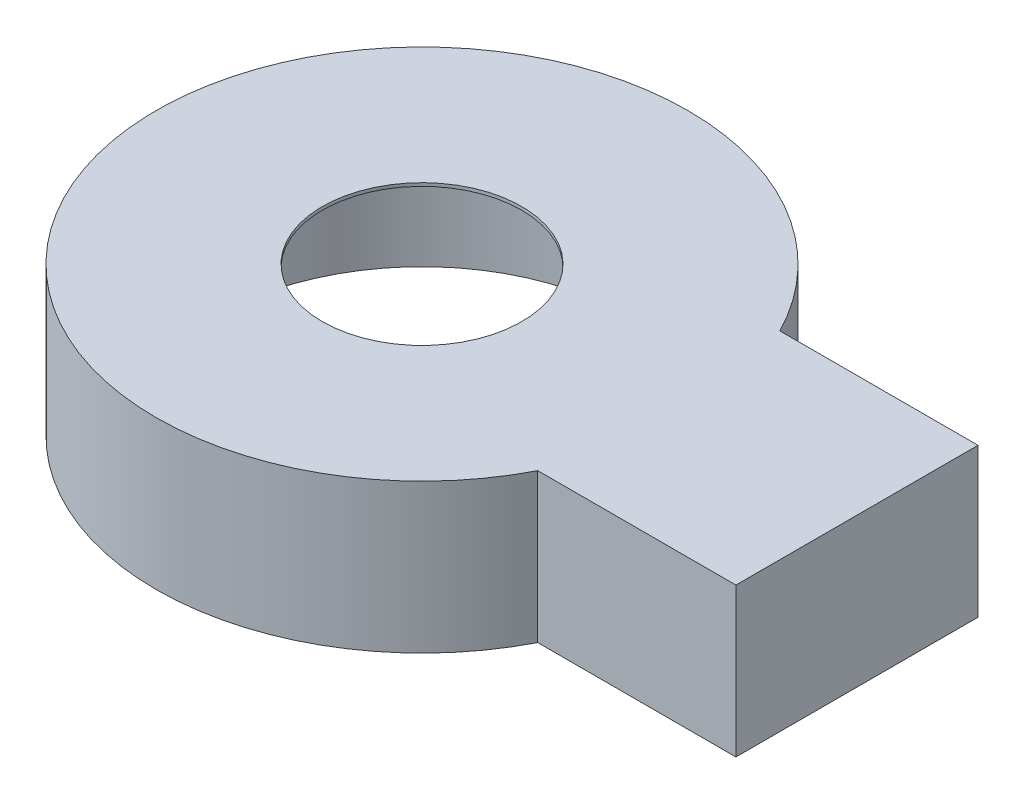
ISO-10303-21;
HEADER;
FILE_DESCRIPTION(('STEP AP214'),'2;1');
FILE_NAME('part.step','',(''),(''),'','','');
FILE_SCHEMA(('AUTOMOTIVE_DESIGN { 1 0 10303 214 1 1 1 1 }'));
ENDSEC;
DATA;
#1=APPLICATION_CONTEXT('core data for automotive mechanical design processes');
#2=APPLICATION_PROTOCOL_DEFINITION('international standard','automotive_design',2000,#1);
#3=PRODUCT_CONTEXT('',#1,'mechanical');
#4=PRODUCT('Part','Part','',(#3));
#5=PRODUCT_RELATED_PRODUCT_CATEGORY('part','',(#4));
#6=PRODUCT_DEFINITION_FORMATION('','',#4);
#7=PRODUCT_DEFINITION_CONTEXT('part definition',#1,'design');
#8=PRODUCT_DEFINITION('design','',#6,#7);
#9=PRODUCT_DEFINITION_SHAPE('','',#8);
#10=(LENGTH_UNIT() NAMED_UNIT(*) SI_UNIT(.MILLI.,.METRE.));
#11=(NAMED_UNIT(*) PLANE_ANGLE_UNIT() SI_UNIT($,.RADIAN.));
#12=(NAMED_UNIT(*) SI_UNIT($,.STERADIAN.) SOLID_ANGLE_UNIT());
#13=UNCERTAINTY_MEASURE_WITH_UNIT(LENGTH_MEASURE(1.E-05),#10,'distance_accuracy_value','');
#14=(GEOMETRIC_REPRESENTATION_CONTEXT(3) GLOBAL_UNCERTAINTY_ASSIGNED_CONTEXT((#13)) GLOBAL_UNIT_ASSIGNED_CONTEXT((#10,
#11,#12)) REPRESENTATION_CONTEXT('',''));
#15=CARTESIAN_POINT('',(0.,0.,0.));
#16=DIRECTION('',(0.,0.,1.));
#17=DIRECTION('',(1.,0.,0.));
#18=AXIS2_PLACEMENT_3D('',#15,#16,#17);
#19=CARTESIAN_POINT('',(0.,-3.556,0.));
#20=DIRECTION('',(0.,1.,0.));
#21=DIRECTION('',(0.,0.,1.));
#22=AXIS2_PLACEMENT_3D('',#19,#20,#21);
#23=PLANE('',#22);
#24=CARTESIAN_POINT('',(0.,-3.556,0.));
#25=DIRECTION('',(0.,1.,0.));
#26=DIRECTION('',(0.,0.,1.));
#27=AXIS2_PLACEMENT_3D('',#24,#25,#26);
#28=CIRCLE('',#27,6.35);
#29=CARTESIAN_POINT('',(5.65400955925136,-3.556,-2.8904456237567));
#30=VERTEX_POINT('',#29);
#31=CARTESIAN_POINT('',(5.65400955925136,-3.556,2.8904456237567));
#32=VERTEX_POINT('',#31);
#33=EDGE_CURVE('E176',#30,#32,#28,.T.);
#34=ORIENTED_EDGE('',*,*,#33,.F.);
#35=DIRECTION('',(-1.,0.,0.));
#36=VECTOR('',#35,1.);
#37=CARTESIAN_POINT('',(8.02011647499063,-3.556,-2.8904456237567));
#38=LINE('',#37,#36);
#39=CARTESIAN_POINT('',(10.3862233907299,-3.556,-2.8904456237567));
#40=VERTEX_POINT('',#39);
#41=EDGE_CURVE('E74',#40,#30,#38,.T.);
#42=ORIENTED_EDGE('',*,*,#41,.F.);
#43=DIRECTION('',(0.,0.,-1.));
#44=VECTOR('',#43,1.);
#45=CARTESIAN_POINT('',(10.3862233907299,-3.556,-2.8904456237567));
#46=LINE('',#45,#44);
#47=CARTESIAN_POINT('',(10.3862233907299,-3.556,2.8904456237567));
#48=VERTEX_POINT('',#47);
#49=EDGE_CURVE('E254',#48,#40,#46,.T.);
#50=ORIENTED_EDGE('',*,*,#49,.F.);
#51=DIRECTION('',(1.,0.,0.));
#52=VECTOR('',#51,1.);
#53=CARTESIAN_POINT('',(5.65400955925136,-3.556,2.8904456237567));
#54=LINE('',#53,#52);
#55=EDGE_CURVE('E258',#32,#48,#54,.T.);
#56=ORIENTED_EDGE('',*,*,#55,.F.);
#57=EDGE_LOOP('',(#34,#42,#50,#56));
#58=FACE_BOUND('',#57,.T.);
#59=CARTESIAN_POINT('',(0.,-3.556,0.));
#60=DIRECTION('',(0.,-1.,0.));
#61=DIRECTION('',(0.,0.,-1.));
#62=AXIS2_PLACEMENT_3D('',#59,#60,#61);
#63=CIRCLE('',#62,4.953);
#64=CARTESIAN_POINT('',(4.92555382774364,-3.556,-0.5207));
#65=VERTEX_POINT('',#64);
#66=CARTESIAN_POINT('',(4.92555382774364,-3.556,0.5207));
#67=VERTEX_POINT('',#66);
#68=EDGE_CURVE('E66',#65,#67,#63,.F.);
#69=ORIENTED_EDGE('',*,*,#68,.T.);
#70=DIRECTION('',(1.,0.,0.));
#71=VECTOR('',#70,1.);
#72=CARTESIAN_POINT('',(0.,-3.556,0.5207));
#73=LINE('',#72,#71);
#74=CARTESIAN_POINT('',(9.87855382774363,-3.556,0.5207));
#75=VERTEX_POINT('',#74);
#76=EDGE_CURVE('E140',#67,#75,#73,.T.);
#77=ORIENTED_EDGE('',*,*,#76,.T.);
#78=DIRECTION('',(0.,0.,1.));
#79=VECTOR('',#78,1.);
#80=CARTESIAN_POINT('',(9.87855382774363,-3.556,0.));
#81=LINE('',#80,#79);
#82=CARTESIAN_POINT('',(9.87855382774363,-3.556,-0.5207));
#83=VERTEX_POINT('',#82);
#84=EDGE_CURVE('E269',#83,#75,#81,.T.);
#85=ORIENTED_EDGE('',*,*,#84,.F.);
#86=DIRECTION('',(1.,0.,0.));
#87=VECTOR('',#86,1.);
#88=CARTESIAN_POINT('',(0.,-3.556,-0.520700000000001));
#89=LINE('',#88,#87);
#90=EDGE_CURVE('E284',#65,#83,#89,.T.);
#91=ORIENTED_EDGE('',*,*,#90,.F.);
#92=EDGE_LOOP('',(#69,#77,#85,#91));
#93=FACE_BOUND('',#92,.T.);
#94=ADVANCED_FACE('F47',(#58,#93),#23,.F.);
#95=CARTESIAN_POINT('',(0.,-3.556,0.));
#96=DIRECTION('',(0.,1.,0.));
#97=DIRECTION('',(0.,0.,1.));
#98=AXIS2_PLACEMENT_3D('',#95,#96,#97);
#99=CYLINDRICAL_SURFACE('',#98,2.38125);
#100=CARTESIAN_POINT('',(0.,0.,0.));
#101=DIRECTION('',(0.,1.,0.));
#102=DIRECTION('',(0.,0.,1.));
#103=AXIS2_PLACEMENT_3D('',#100,#101,#102);
#104=CIRCLE('',#103,2.38125);
#105=CARTESIAN_POINT('',(0.,0.,2.38125));
#106=VERTEX_POINT('',#105);
#107=EDGE_CURVE('E188',#106,#106,#104,.T.);
#108=ORIENTED_EDGE('',*,*,#107,.T.);
#109=EDGE_LOOP('',(#108));
#110=FACE_BOUND('',#109,.T.);
#111=CARTESIAN_POINT('',(0.,-0.0761999999999998,0.));
#112=DIRECTION('',(0.,-1.,0.));
#113=DIRECTION('',(0.,0.,-1.));
#114=AXIS2_PLACEMENT_3D('',#111,#112,#113);
#115=CIRCLE('',#114,2.38125);
#116=CARTESIAN_POINT('',(0.,-0.0761999999999998,-2.38125));
#117=VERTEX_POINT('',#116);
#118=EDGE_CURVE('E129',#117,#117,#115,.F.);
#119=ORIENTED_EDGE('',*,*,#118,.F.);
#120=EDGE_LOOP('',(#119));
#121=FACE_BOUND('',#120,.T.);
#122=ADVANCED_FACE('F299',(#110,#121),#99,.F.);
#123=CARTESIAN_POINT('',(0.,-3.556,0.));
#124=DIRECTION('',(0.,1.,0.));
#125=DIRECTION('',(0.,0.,1.));
#126=AXIS2_PLACEMENT_3D('',#123,#124,#125);
#127=CYLINDRICAL_SURFACE('',#126,6.35);
#128=CARTESIAN_POINT('',(0.,0.,0.));
#129=DIRECTION('',(0.,1.,0.));
#130=DIRECTION('',(0.,0.,1.));
#131=AXIS2_PLACEMENT_3D('',#128,#129,#130);
#132=CIRCLE('',#131,6.35);
#133=CARTESIAN_POINT('',(5.65400955925136,0.,-2.8904456237567));
#134=VERTEX_POINT('',#133);
#135=CARTESIAN_POINT('',(5.65400955925136,0.,2.8904456237567));
#136=VERTEX_POINT('',#135);
#137=EDGE_CURVE('E165',#134,#136,#132,.T.);
#138=ORIENTED_EDGE('',*,*,#137,.F.);
#139=DIRECTION('',(0.,1.,0.));
#140=VECTOR('',#139,1.);
#141=CARTESIAN_POINT('',(5.65400955925136,-3.556,-2.8904456237567));
#142=LINE('',#141,#140);
#143=EDGE_CURVE('E12',#30,#134,#142,.T.);
#144=ORIENTED_EDGE('',*,*,#143,.F.);
#145=ORIENTED_EDGE('',*,*,#33,.T.);
#146=DIRECTION('',(0.,1.,0.));
#147=VECTOR('',#146,1.);
#148=CARTESIAN_POINT('',(5.65400955925136,-3.556,2.8904456237567));
#149=LINE('',#148,#147);
#150=EDGE_CURVE('E51',#32,#136,#149,.T.);
#151=ORIENTED_EDGE('',*,*,#150,.T.);
#152=EDGE_LOOP('',(#138,#144,#145,#151));
#153=FACE_BOUND('',#152,.T.);
#154=ADVANCED_FACE('F49',(#153),#127,.T.);
#155=CARTESIAN_POINT('',(5.65400955925136,-3.556,-2.8904456237567));
#156=DIRECTION('',(0.,0.,-1.));
#157=DIRECTION('',(-1.,0.,0.));
#158=AXIS2_PLACEMENT_3D('',#155,#156,#157);
#159=PLANE('',#158);
#160=DIRECTION('',(-1.,0.,0.));
#161=VECTOR('',#160,1.);
#162=CARTESIAN_POINT('',(5.65400955925136,0.,-2.8904456237567));
#163=LINE('',#162,#161);
#164=CARTESIAN_POINT('',(10.3862233907299,0.,-2.8904456237567));
#165=VERTEX_POINT('',#164);
#166=EDGE_CURVE('E172',#165,#134,#163,.T.);
#167=ORIENTED_EDGE('',*,*,#166,.F.);
#168=DIRECTION('',(0.,1.,0.));
#169=VECTOR('',#168,1.);
#170=CARTESIAN_POINT('',(10.3862233907299,-3.556,-2.8904456237567));
#171=LINE('',#170,#169);
#172=EDGE_CURVE('E58',#40,#165,#171,.T.);
#173=ORIENTED_EDGE('',*,*,#172,.F.);
#174=ORIENTED_EDGE('',*,*,#41,.T.);
#175=ORIENTED_EDGE('',*,*,#143,.T.);
#176=EDGE_LOOP('',(#167,#173,#174,#175));
#177=FACE_BOUND('',#176,.T.);
#178=ADVANCED_FACE('F307',(#177),#159,.T.);
#179=CARTESIAN_POINT('',(10.3862233907299,-3.556,-2.8904456237567));
#180=DIRECTION('',(1.,0.,0.));
#181=DIRECTION('',(0.,0.,-1.));
#182=AXIS2_PLACEMENT_3D('',#179,#180,#181);
#183=PLANE('',#182);
#184=DIRECTION('',(0.,0.,-1.));
#185=VECTOR('',#184,1.);
#186=CARTESIAN_POINT('',(10.3862233907299,0.,-2.8904456237567));
#187=LINE('',#186,#185);
#188=CARTESIAN_POINT('',(10.3862233907299,0.,2.8904456237567));
#189=VERTEX_POINT('',#188);
#190=EDGE_CURVE('E164',#189,#165,#187,.T.);
#191=ORIENTED_EDGE('',*,*,#190,.F.);
#192=DIRECTION('',(0.,1.,0.));
#193=VECTOR('',#192,1.);
#194=CARTESIAN_POINT('',(10.3862233907299,-3.556,2.8904456237567));
#195=LINE('',#194,#193);
#196=EDGE_CURVE('E223',#48,#189,#195,.T.);
#197=ORIENTED_EDGE('',*,*,#196,.F.);
#198=ORIENTED_EDGE('',*,*,#49,.T.);
#199=ORIENTED_EDGE('',*,*,#172,.T.);
#200=EDGE_LOOP('',(#191,#197,#198,#199));
#201=FACE_BOUND('',#200,.T.);
#202=ADVANCED_FACE('F321',(#201),#183,.T.);
#203=CARTESIAN_POINT('',(8.02011647499063,-3.556,2.8904456237567));
#204=DIRECTION('',(0.,0.,1.));
#205=DIRECTION('',(1.,0.,0.));
#206=AXIS2_PLACEMENT_3D('',#203,#204,#205);
#207=PLANE('',#206);
#208=DIRECTION('',(1.,0.,0.));
#209=VECTOR('',#208,1.);
#210=CARTESIAN_POINT('',(8.02011647499063,0.,2.8904456237567));
#211=LINE('',#210,#209);
#212=EDGE_CURVE('E160',#136,#189,#211,.T.);
#213=ORIENTED_EDGE('',*,*,#212,.F.);
#214=ORIENTED_EDGE('',*,*,#150,.F.);
#215=ORIENTED_EDGE('',*,*,#55,.T.);
#216=ORIENTED_EDGE('',*,*,#196,.T.);
#217=EDGE_LOOP('',(#213,#214,#215,#216));
#218=FACE_BOUND('',#217,.T.);
#219=ADVANCED_FACE('F317',(#218),#207,.T.);
#220=CARTESIAN_POINT('',(0.,0.,0.));
#221=DIRECTION('',(0.,1.,0.));
#222=DIRECTION('',(0.,0.,1.));
#223=AXIS2_PLACEMENT_3D('',#220,#221,#222);
#224=PLANE('',#223);
#225=ORIENTED_EDGE('',*,*,#107,.F.);
#226=EDGE_LOOP('',(#225));
#227=FACE_BOUND('',#226,.T.);
#228=ORIENTED_EDGE('',*,*,#137,.T.);
#229=ORIENTED_EDGE('',*,*,#212,.T.);
#230=ORIENTED_EDGE('',*,*,#190,.T.);
#231=ORIENTED_EDGE('',*,*,#166,.T.);
#232=EDGE_LOOP('',(#228,#229,#230,#231));
#233=FACE_BOUND('',#232,.T.);
#234=ADVANCED_FACE('F314',(#227,#233),#224,.T.);
#235=CARTESIAN_POINT('',(0.,-0.0761999999999998,0.));
#236=DIRECTION('',(0.,-1.,0.));
#237=DIRECTION('',(0.,0.,-1.));
#238=AXIS2_PLACEMENT_3D('',#235,#236,#237);
#239=CYLINDRICAL_SURFACE('',#238,4.953);
#240=ORIENTED_EDGE('',*,*,#68,.F.);
#241=DIRECTION('',(0.,-1.,0.));
#242=VECTOR('',#241,1.);
#243=CARTESIAN_POINT('',(4.92555382774364,-0.0761999999999998,-0.5207));
#244=LINE('',#243,#242);
#245=CARTESIAN_POINT('',(4.92555382774364,-0.0761999999999998,-0.5207));
#246=VERTEX_POINT('',#245);
#247=EDGE_CURVE('E118',#246,#65,#244,.T.);
#248=ORIENTED_EDGE('',*,*,#247,.F.);
#249=CARTESIAN_POINT('',(0.,-0.0761999999999998,0.));
#250=DIRECTION('',(0.,-1.,0.));
#251=DIRECTION('',(0.,0.,-1.));
#252=AXIS2_PLACEMENT_3D('',#249,#250,#251);
#253=CIRCLE('',#252,4.953);
#254=CARTESIAN_POINT('',(4.92555382774364,-0.0761999999999998,0.5207));
#255=VERTEX_POINT('',#254);
#256=EDGE_CURVE('E121',#246,#255,#253,.F.);
#257=ORIENTED_EDGE('',*,*,#256,.T.);
#258=DIRECTION('',(0.,-1.,0.));
#259=VECTOR('',#258,1.);
#260=CARTESIAN_POINT('',(4.92555382774364,-0.0761999999999998,0.5207));
#261=LINE('',#260,#259);
#262=EDGE_CURVE('E193',#255,#67,#261,.T.);
#263=ORIENTED_EDGE('',*,*,#262,.T.);
#264=EDGE_LOOP('',(#240,#248,#257,#263));
#265=FACE_BOUND('',#264,.T.);
#266=ADVANCED_FACE('F120',(#265),#239,.F.);
#267=CARTESIAN_POINT('',(0.,-0.0761999999999998,0.5207));
#268=DIRECTION('',(0.,0.,-1.));
#269=DIRECTION('',(-1.,0.,0.));
#270=AXIS2_PLACEMENT_3D('',#267,#268,#269);
#271=PLANE('',#270);
#272=ORIENTED_EDGE('',*,*,#76,.F.);
#273=ORIENTED_EDGE('',*,*,#262,.F.);
#274=DIRECTION('',(1.,0.,0.));
#275=VECTOR('',#274,1.);
#276=CARTESIAN_POINT('',(0.,-0.0761999999999998,0.5207));
#277=LINE('',#276,#275);
#278=CARTESIAN_POINT('',(9.87855382774363,-0.0761999999999998,0.5207));
#279=VERTEX_POINT('',#278);
#280=EDGE_CURVE('E138',#255,#279,#277,.T.);
#281=ORIENTED_EDGE('',*,*,#280,.T.);
#282=DIRECTION('',(0.,-1.,0.));
#283=VECTOR('',#282,1.);
#284=CARTESIAN_POINT('',(9.87855382774363,-0.0761999999999998,0.5207));
#285=LINE('',#284,#283);
#286=EDGE_CURVE('E274',#279,#75,#285,.T.);
#287=ORIENTED_EDGE('',*,*,#286,.T.);
#288=EDGE_LOOP('',(#272,#273,#281,#287));
#289=FACE_BOUND('',#288,.T.);
#290=ADVANCED_FACE('F345',(#289),#271,.T.);
#291=CARTESIAN_POINT('',(9.87855382774363,-0.0761999999999998,0.));
#292=DIRECTION('',(1.,0.,0.));
#293=DIRECTION('',(0.,0.,-1.));
#294=AXIS2_PLACEMENT_3D('',#291,#292,#293);
#295=PLANE('',#294);
#296=ORIENTED_EDGE('',*,*,#84,.T.);
#297=ORIENTED_EDGE('',*,*,#286,.F.);
#298=DIRECTION('',(0.,0.,1.));
#299=VECTOR('',#298,1.);
#300=CARTESIAN_POINT('',(9.87855382774363,-0.0761999999999998,0.));
#301=LINE('',#300,#299);
#302=CARTESIAN_POINT('',(9.87855382774363,-0.0761999999999998,-0.5207));
#303=VERTEX_POINT('',#302);
#304=EDGE_CURVE('E145',#303,#279,#301,.T.);
#305=ORIENTED_EDGE('',*,*,#304,.F.);
#306=DIRECTION('',(0.,-1.,0.));
#307=VECTOR('',#306,1.);
#308=CARTESIAN_POINT('',(9.87855382774363,-0.0761999999999998,-0.5207));
#309=LINE('',#308,#307);
#310=EDGE_CURVE('E128',#303,#83,#309,.T.);
#311=ORIENTED_EDGE('',*,*,#310,.T.);
#312=EDGE_LOOP('',(#296,#297,#305,#311));
#313=FACE_BOUND('',#312,.T.);
#314=ADVANCED_FACE('F282',(#313),#295,.F.);
#315=CARTESIAN_POINT('',(0.,-0.0761999999999998,-0.520700000000001));
#316=DIRECTION('',(0.,0.,-1.));
#317=DIRECTION('',(-1.,0.,0.));
#318=AXIS2_PLACEMENT_3D('',#315,#316,#317);
#319=PLANE('',#318);
#320=ORIENTED_EDGE('',*,*,#90,.T.);
#321=ORIENTED_EDGE('',*,*,#310,.F.);
#322=DIRECTION('',(1.,0.,0.));
#323=VECTOR('',#322,1.);
#324=CARTESIAN_POINT('',(0.,-0.0761999999999998,-0.520700000000001));
#325=LINE('',#324,#323);
#326=EDGE_CURVE('E137',#246,#303,#325,.T.);
#327=ORIENTED_EDGE('',*,*,#326,.F.);
#328=ORIENTED_EDGE('',*,*,#247,.T.);
#329=EDGE_LOOP('',(#320,#321,#327,#328));
#330=FACE_BOUND('',#329,.T.);
#331=ADVANCED_FACE('F142',(#330),#319,.F.);
#332=CARTESIAN_POINT('',(0.,-0.0761999999999998,0.));
#333=DIRECTION('',(0.,-1.,0.));
#334=DIRECTION('',(0.,0.,-1.));
#335=AXIS2_PLACEMENT_3D('',#332,#333,#334);
#336=PLANE('',#335);
#337=ORIENTED_EDGE('',*,*,#256,.F.);
#338=ORIENTED_EDGE('',*,*,#326,.T.);
#339=ORIENTED_EDGE('',*,*,#304,.T.);
#340=ORIENTED_EDGE('',*,*,#280,.F.);
#341=EDGE_LOOP('',(#337,#338,#339,#340));
#342=FACE_BOUND('',#341,.T.);
#343=ORIENTED_EDGE('',*,*,#118,.T.);
#344=EDGE_LOOP('',(#343));
#345=FACE_BOUND('',#344,.T.);
#346=ADVANCED_FACE('F134',(#342,#345),#336,.T.);
#347=CLOSED_SHELL('',(#94,#122,#154,#178,#202,#219,#234,#266,#290,#314,#331,#346));
#348=MANIFOLD_SOLID_BREP('B2',#347);
#349=ADVANCED_BREP_SHAPE_REPRESENTATION('',(#18,#348),#14);
#350=SHAPE_DEFINITION_REPRESENTATION(#9,#349);
ENDSEC;
END-ISO-10303-21;
